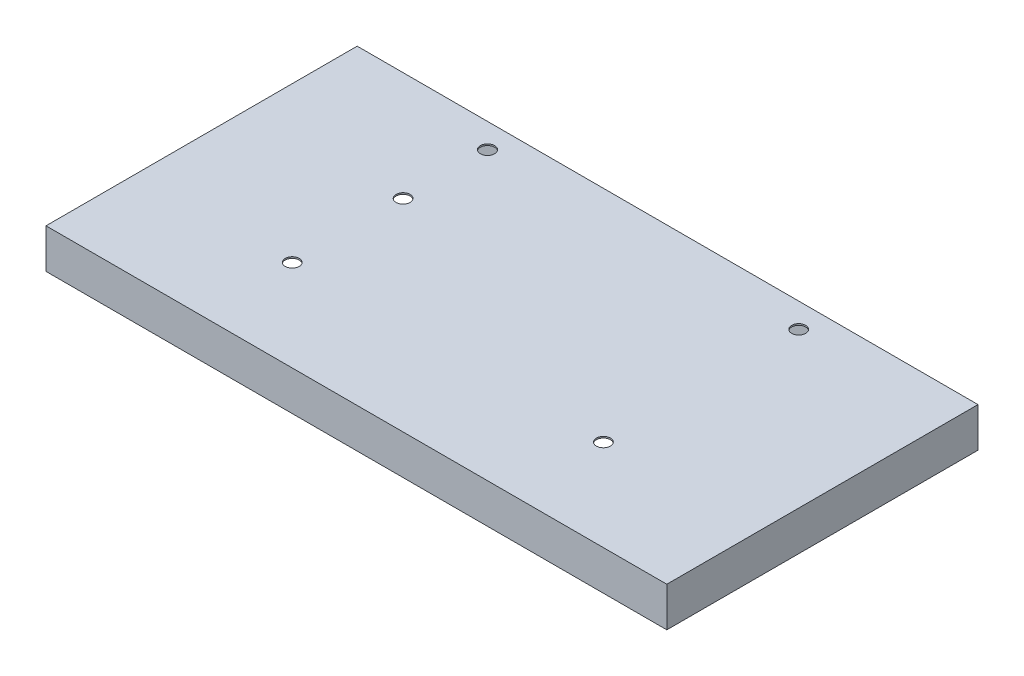
ISO-10303-21;
HEADER;
FILE_DESCRIPTION(('STEP AP214'),'2;1');
FILE_NAME('part.step','',(''),(''),'','','');
FILE_SCHEMA(('AUTOMOTIVE_DESIGN { 1 0 10303 214 1 1 1 1 }'));
ENDSEC;
DATA;
#1=APPLICATION_CONTEXT('core data for automotive mechanical design processes');
#2=APPLICATION_PROTOCOL_DEFINITION('international standard','automotive_design',2000,#1);
#3=PRODUCT_CONTEXT('',#1,'mechanical');
#4=PRODUCT('Part','Part','',(#3));
#5=PRODUCT_RELATED_PRODUCT_CATEGORY('part','',(#4));
#6=PRODUCT_DEFINITION_FORMATION('','',#4);
#7=PRODUCT_DEFINITION_CONTEXT('part definition',#1,'design');
#8=PRODUCT_DEFINITION('design','',#6,#7);
#9=PRODUCT_DEFINITION_SHAPE('','',#8);
#10=(LENGTH_UNIT() NAMED_UNIT(*) SI_UNIT(.MILLI.,.METRE.));
#11=(NAMED_UNIT(*) PLANE_ANGLE_UNIT() SI_UNIT($,.RADIAN.));
#12=(NAMED_UNIT(*) SI_UNIT($,.STERADIAN.) SOLID_ANGLE_UNIT());
#13=UNCERTAINTY_MEASURE_WITH_UNIT(LENGTH_MEASURE(1.E-05),#10,'distance_accuracy_value','');
#14=(GEOMETRIC_REPRESENTATION_CONTEXT(3) GLOBAL_UNCERTAINTY_ASSIGNED_CONTEXT((#13)) GLOBAL_UNIT_ASSIGNED_CONTEXT((#10,
#11,#12)) REPRESENTATION_CONTEXT('',''));
#15=CARTESIAN_POINT('',(0.,0.,0.));
#16=DIRECTION('',(0.,0.,1.));
#17=DIRECTION('',(1.,0.,0.));
#18=AXIS2_PLACEMENT_3D('',#15,#16,#17);
#19=CARTESIAN_POINT('',(399.,50.8,-200.));
#20=DIRECTION('',(-1.,0.,0.));
#21=DIRECTION('',(0.,0.,1.));
#22=AXIS2_PLACEMENT_3D('',#19,#20,#21);
#23=PLANE('',#22);
#24=DIRECTION('',(0.,0.,-1.));
#25=VECTOR('',#24,1.);
#26=CARTESIAN_POINT('',(399.,0.,-200.));
#27=LINE('',#26,#25);
#28=CARTESIAN_POINT('',(399.,0.,200.));
#29=VERTEX_POINT('',#28);
#30=CARTESIAN_POINT('',(399.,0.,-200.));
#31=VERTEX_POINT('',#30);
#32=EDGE_CURVE('E132',#29,#31,#27,.T.);
#33=ORIENTED_EDGE('',*,*,#32,.T.);
#34=DIRECTION('',(0.,-1.,0.));
#35=VECTOR('',#34,1.);
#36=CARTESIAN_POINT('',(399.,50.8,-200.));
#37=LINE('',#36,#35);
#38=CARTESIAN_POINT('',(399.,50.8,-200.));
#39=VERTEX_POINT('',#38);
#40=EDGE_CURVE('E11',#39,#31,#37,.T.);
#41=ORIENTED_EDGE('',*,*,#40,.F.);
#42=DIRECTION('',(0.,0.,-1.));
#43=VECTOR('',#42,1.);
#44=CARTESIAN_POINT('',(399.,50.8,-200.));
#45=LINE('',#44,#43);
#46=CARTESIAN_POINT('',(399.,50.8,200.));
#47=VERTEX_POINT('',#46);
#48=EDGE_CURVE('E156',#47,#39,#45,.T.);
#49=ORIENTED_EDGE('',*,*,#48,.F.);
#50=DIRECTION('',(0.,-1.,0.));
#51=VECTOR('',#50,1.);
#52=CARTESIAN_POINT('',(399.,50.8,200.));
#53=LINE('',#52,#51);
#54=EDGE_CURVE('E161',#47,#29,#53,.T.);
#55=ORIENTED_EDGE('',*,*,#54,.T.);
#56=EDGE_LOOP('',(#33,#41,#49,#55));
#57=FACE_BOUND('',#56,.T.);
#58=ADVANCED_FACE('F34',(#57),#23,.F.);
#59=CARTESIAN_POINT('',(-399.,50.8,-200.));
#60=DIRECTION('',(0.,0.,1.));
#61=DIRECTION('',(1.,0.,0.));
#62=AXIS2_PLACEMENT_3D('',#59,#60,#61);
#63=PLANE('',#62);
#64=DIRECTION('',(-1.,0.,0.));
#65=VECTOR('',#64,1.);
#66=CARTESIAN_POINT('',(-399.,0.,-200.));
#67=LINE('',#66,#65);
#68=CARTESIAN_POINT('',(-399.,0.,-200.));
#69=VERTEX_POINT('',#68);
#70=EDGE_CURVE('E136',#31,#69,#67,.T.);
#71=ORIENTED_EDGE('',*,*,#70,.T.);
#72=DIRECTION('',(0.,-1.,0.));
#73=VECTOR('',#72,1.);
#74=CARTESIAN_POINT('',(-399.,50.8,-200.));
#75=LINE('',#74,#73);
#76=CARTESIAN_POINT('',(-399.,50.8,-200.));
#77=VERTEX_POINT('',#76);
#78=EDGE_CURVE('E42',#77,#69,#75,.T.);
#79=ORIENTED_EDGE('',*,*,#78,.F.);
#80=DIRECTION('',(-1.,0.,0.));
#81=VECTOR('',#80,1.);
#82=CARTESIAN_POINT('',(-399.,50.8,-200.));
#83=LINE('',#82,#81);
#84=EDGE_CURVE('E87',#39,#77,#83,.T.);
#85=ORIENTED_EDGE('',*,*,#84,.F.);
#86=ORIENTED_EDGE('',*,*,#40,.T.);
#87=EDGE_LOOP('',(#71,#79,#85,#86));
#88=FACE_BOUND('',#87,.T.);
#89=ADVANCED_FACE('F203',(#88),#63,.F.);
#90=CARTESIAN_POINT('',(-399.,50.8,-200.));
#91=DIRECTION('',(1.,0.,0.));
#92=DIRECTION('',(0.,0.,-1.));
#93=AXIS2_PLACEMENT_3D('',#90,#91,#92);
#94=PLANE('',#93);
#95=DIRECTION('',(0.,0.,1.));
#96=VECTOR('',#95,1.);
#97=CARTESIAN_POINT('',(-399.,0.,-200.));
#98=LINE('',#97,#96);
#99=CARTESIAN_POINT('',(-399.,0.,200.));
#100=VERTEX_POINT('',#99);
#101=EDGE_CURVE('E164',#69,#100,#98,.T.);
#102=ORIENTED_EDGE('',*,*,#101,.T.);
#103=DIRECTION('',(0.,-1.,0.));
#104=VECTOR('',#103,1.);
#105=CARTESIAN_POINT('',(-399.,50.8,200.));
#106=LINE('',#105,#104);
#107=CARTESIAN_POINT('',(-399.,50.8,200.));
#108=VERTEX_POINT('',#107);
#109=EDGE_CURVE('E168',#108,#100,#106,.T.);
#110=ORIENTED_EDGE('',*,*,#109,.F.);
#111=DIRECTION('',(0.,0.,1.));
#112=VECTOR('',#111,1.);
#113=CARTESIAN_POINT('',(-399.,50.8,-200.));
#114=LINE('',#113,#112);
#115=EDGE_CURVE('E159',#77,#108,#114,.T.);
#116=ORIENTED_EDGE('',*,*,#115,.F.);
#117=ORIENTED_EDGE('',*,*,#78,.T.);
#118=EDGE_LOOP('',(#102,#110,#116,#117));
#119=FACE_BOUND('',#118,.T.);
#120=ADVANCED_FACE('F208',(#119),#94,.F.);
#121=CARTESIAN_POINT('',(-399.,50.8,200.));
#122=DIRECTION('',(0.,0.,-1.));
#123=DIRECTION('',(-1.,0.,0.));
#124=AXIS2_PLACEMENT_3D('',#121,#122,#123);
#125=PLANE('',#124);
#126=DIRECTION('',(1.,0.,0.));
#127=VECTOR('',#126,1.);
#128=CARTESIAN_POINT('',(-399.,0.,200.));
#129=LINE('',#128,#127);
#130=EDGE_CURVE('E80',#100,#29,#129,.T.);
#131=ORIENTED_EDGE('',*,*,#130,.T.);
#132=ORIENTED_EDGE('',*,*,#54,.F.);
#133=DIRECTION('',(1.,0.,0.));
#134=VECTOR('',#133,1.);
#135=CARTESIAN_POINT('',(-399.,50.8,200.));
#136=LINE('',#135,#134);
#137=EDGE_CURVE('E59',#108,#47,#136,.T.);
#138=ORIENTED_EDGE('',*,*,#137,.F.);
#139=ORIENTED_EDGE('',*,*,#109,.T.);
#140=EDGE_LOOP('',(#131,#132,#138,#139));
#141=FACE_BOUND('',#140,.T.);
#142=ADVANCED_FACE('F196',(#141),#125,.F.);
#143=CARTESIAN_POINT('',(0.,50.8,0.));
#144=DIRECTION('',(0.,1.,0.));
#145=DIRECTION('',(0.,0.,1.));
#146=AXIS2_PLACEMENT_3D('',#143,#144,#145);
#147=PLANE('',#146);
#148=CARTESIAN_POINT('',(-199.99999999997,50.8,-168.499999999993));
#149=DIRECTION('',(0.,1.,0.));
#150=DIRECTION('',(0.,0.,1.));
#151=AXIS2_PLACEMENT_3D('',#148,#149,#150);
#152=CIRCLE('',#151,9.17877309023134);
#153=CARTESIAN_POINT('',(-199.99999999997,50.8,-159.321226909761));
#154=VERTEX_POINT('',#153);
#155=EDGE_CURVE('E337',#154,#154,#152,.T.);
#156=ORIENTED_EDGE('',*,*,#155,.F.);
#157=EDGE_LOOP('',(#156));
#158=FACE_BOUND('',#157,.T.);
#159=CARTESIAN_POINT('',(-199.999999999969,50.8,-59.9999999999926));
#160=DIRECTION('',(0.,1.,0.));
#161=DIRECTION('',(0.,0.,1.));
#162=AXIS2_PLACEMENT_3D('',#159,#160,#161);
#163=CIRCLE('',#162,9.00000000000001);
#164=CARTESIAN_POINT('',(-199.999999999969,50.8,-50.9999999999926));
#165=VERTEX_POINT('',#164);
#166=EDGE_CURVE('E338',#165,#165,#163,.T.);
#167=ORIENTED_EDGE('',*,*,#166,.F.);
#168=EDGE_LOOP('',(#167));
#169=FACE_BOUND('',#168,.T.);
#170=CARTESIAN_POINT('',(-199.999999999967,50.8,82.5000000000074));
#171=DIRECTION('',(0.,1.,0.));
#172=DIRECTION('',(0.,0.,1.));
#173=AXIS2_PLACEMENT_3D('',#170,#171,#172);
#174=CIRCLE('',#173,9.00000000000001);
#175=CARTESIAN_POINT('',(-199.999999999967,50.8,91.5000000000074));
#176=VERTEX_POINT('',#175);
#177=EDGE_CURVE('E341',#176,#176,#174,.T.);
#178=ORIENTED_EDGE('',*,*,#177,.F.);
#179=EDGE_LOOP('',(#178));
#180=FACE_BOUND('',#179,.T.);
#181=CARTESIAN_POINT('',(200.00000000003,50.8,-168.499999999997));
#182=DIRECTION('',(0.,1.,0.));
#183=DIRECTION('',(0.,0.,1.));
#184=AXIS2_PLACEMENT_3D('',#181,#182,#183);
#185=CIRCLE('',#184,9.00000000000001);
#186=CARTESIAN_POINT('',(200.00000000003,50.8,-159.499999999997));
#187=VERTEX_POINT('',#186);
#188=EDGE_CURVE('E178',#187,#187,#185,.T.);
#189=ORIENTED_EDGE('',*,*,#188,.F.);
#190=EDGE_LOOP('',(#189));
#191=FACE_BOUND('',#190,.T.);
#192=CARTESIAN_POINT('',(200.000000000033,50.8,82.5000000000032));
#193=DIRECTION('',(0.,1.,0.));
#194=DIRECTION('',(0.,0.,1.));
#195=AXIS2_PLACEMENT_3D('',#192,#193,#194);
#196=CIRCLE('',#195,9.00000000000001);
#197=CARTESIAN_POINT('',(200.000000000033,50.8,91.5000000000032));
#198=VERTEX_POINT('',#197);
#199=EDGE_CURVE('E141',#198,#198,#196,.T.);
#200=ORIENTED_EDGE('',*,*,#199,.F.);
#201=EDGE_LOOP('',(#200));
#202=FACE_BOUND('',#201,.T.);
#203=ORIENTED_EDGE('',*,*,#48,.T.);
#204=ORIENTED_EDGE('',*,*,#84,.T.);
#205=ORIENTED_EDGE('',*,*,#115,.T.);
#206=ORIENTED_EDGE('',*,*,#137,.T.);
#207=EDGE_LOOP('',(#203,#204,#205,#206));
#208=FACE_BOUND('',#207,.T.);
#209=ADVANCED_FACE('F193',(#158,#169,#180,#191,#202,#208),#147,.T.);
#210=CARTESIAN_POINT('',(0.,0.,0.));
#211=DIRECTION('',(0.,1.,0.));
#212=DIRECTION('',(0.,0.,1.));
#213=AXIS2_PLACEMENT_3D('',#210,#211,#212);
#214=PLANE('',#213);
#215=DIRECTION('',(1.,0.,0.));
#216=VECTOR('',#215,1.);
#217=CARTESIAN_POINT('',(-399.,0.,198.1));
#218=LINE('',#217,#216);
#219=CARTESIAN_POINT('',(-397.1,0.,198.1));
#220=VERTEX_POINT('',#219);
#221=CARTESIAN_POINT('',(397.1,0.,198.1));
#222=VERTEX_POINT('',#221);
#223=EDGE_CURVE('E127',#220,#222,#218,.T.);
#224=ORIENTED_EDGE('',*,*,#223,.T.);
#225=DIRECTION('',(0.,0.,-1.));
#226=VECTOR('',#225,1.);
#227=CARTESIAN_POINT('',(397.1,0.,-200.));
#228=LINE('',#227,#226);
#229=CARTESIAN_POINT('',(397.1,0.,-198.1));
#230=VERTEX_POINT('',#229);
#231=EDGE_CURVE('E149',#222,#230,#228,.T.);
#232=ORIENTED_EDGE('',*,*,#231,.T.);
#233=DIRECTION('',(-1.,0.,0.));
#234=VECTOR('',#233,1.);
#235=CARTESIAN_POINT('',(-399.,0.,-198.1));
#236=LINE('',#235,#234);
#237=CARTESIAN_POINT('',(-397.1,0.,-198.1));
#238=VERTEX_POINT('',#237);
#239=EDGE_CURVE('E131',#230,#238,#236,.T.);
#240=ORIENTED_EDGE('',*,*,#239,.T.);
#241=DIRECTION('',(0.,0.,1.));
#242=VECTOR('',#241,1.);
#243=CARTESIAN_POINT('',(-397.1,0.,-200.));
#244=LINE('',#243,#242);
#245=EDGE_CURVE('E50',#238,#220,#244,.T.);
#246=ORIENTED_EDGE('',*,*,#245,.T.);
#247=EDGE_LOOP('',(#224,#232,#240,#246));
#248=FACE_BOUND('',#247,.T.);
#249=ORIENTED_EDGE('',*,*,#32,.F.);
#250=ORIENTED_EDGE('',*,*,#130,.F.);
#251=ORIENTED_EDGE('',*,*,#101,.F.);
#252=ORIENTED_EDGE('',*,*,#70,.F.);
#253=EDGE_LOOP('',(#249,#250,#251,#252));
#254=FACE_BOUND('',#253,.T.);
#255=ADVANCED_FACE('F195',(#248,#254),#214,.F.);
#256=CARTESIAN_POINT('',(397.1,50.8,-200.));
#257=DIRECTION('',(-1.,0.,0.));
#258=DIRECTION('',(0.,0.,1.));
#259=AXIS2_PLACEMENT_3D('',#256,#257,#258);
#260=PLANE('',#259);
#261=ORIENTED_EDGE('',*,*,#231,.F.);
#262=DIRECTION('',(0.,-1.,0.));
#263=VECTOR('',#262,1.);
#264=CARTESIAN_POINT('',(397.1,50.8,198.1));
#265=LINE('',#264,#263);
#266=CARTESIAN_POINT('',(397.1,48.9,198.1));
#267=VERTEX_POINT('',#266);
#268=EDGE_CURVE('E126',#267,#222,#265,.T.);
#269=ORIENTED_EDGE('',*,*,#268,.F.);
#270=DIRECTION('',(0.,0.,-1.));
#271=VECTOR('',#270,1.);
#272=CARTESIAN_POINT('',(397.1,48.9,-200.));
#273=LINE('',#272,#271);
#274=CARTESIAN_POINT('',(397.1,48.9,-198.1));
#275=VERTEX_POINT('',#274);
#276=EDGE_CURVE('E114',#267,#275,#273,.T.);
#277=ORIENTED_EDGE('',*,*,#276,.T.);
#278=DIRECTION('',(0.,-1.,0.));
#279=VECTOR('',#278,1.);
#280=CARTESIAN_POINT('',(397.1,50.8,-198.1));
#281=LINE('',#280,#279);
#282=EDGE_CURVE('E124',#275,#230,#281,.T.);
#283=ORIENTED_EDGE('',*,*,#282,.T.);
#284=EDGE_LOOP('',(#261,#269,#277,#283));
#285=FACE_BOUND('',#284,.T.);
#286=ADVANCED_FACE('F123',(#285),#260,.T.);
#287=CARTESIAN_POINT('',(-399.,50.8,-198.1));
#288=DIRECTION('',(0.,0.,1.));
#289=DIRECTION('',(1.,0.,0.));
#290=AXIS2_PLACEMENT_3D('',#287,#288,#289);
#291=PLANE('',#290);
#292=ORIENTED_EDGE('',*,*,#239,.F.);
#293=ORIENTED_EDGE('',*,*,#282,.F.);
#294=DIRECTION('',(-1.,0.,0.));
#295=VECTOR('',#294,1.);
#296=CARTESIAN_POINT('',(-399.,48.9,-198.1));
#297=LINE('',#296,#295);
#298=CARTESIAN_POINT('',(-397.1,48.9,-198.1));
#299=VERTEX_POINT('',#298);
#300=EDGE_CURVE('E110',#275,#299,#297,.T.);
#301=ORIENTED_EDGE('',*,*,#300,.T.);
#302=DIRECTION('',(0.,-1.,0.));
#303=VECTOR('',#302,1.);
#304=CARTESIAN_POINT('',(-397.1,50.8,-198.1));
#305=LINE('',#304,#303);
#306=EDGE_CURVE('E133',#299,#238,#305,.T.);
#307=ORIENTED_EDGE('',*,*,#306,.T.);
#308=EDGE_LOOP('',(#292,#293,#301,#307));
#309=FACE_BOUND('',#308,.T.);
#310=ADVANCED_FACE('F129',(#309),#291,.T.);
#311=CARTESIAN_POINT('',(-397.1,50.8,-200.));
#312=DIRECTION('',(1.,0.,0.));
#313=DIRECTION('',(0.,0.,-1.));
#314=AXIS2_PLACEMENT_3D('',#311,#312,#313);
#315=PLANE('',#314);
#316=ORIENTED_EDGE('',*,*,#245,.F.);
#317=ORIENTED_EDGE('',*,*,#306,.F.);
#318=DIRECTION('',(0.,0.,1.));
#319=VECTOR('',#318,1.);
#320=CARTESIAN_POINT('',(-397.1,48.9,-200.));
#321=LINE('',#320,#319);
#322=CARTESIAN_POINT('',(-397.1,48.9,198.1));
#323=VERTEX_POINT('',#322);
#324=EDGE_CURVE('E115',#299,#323,#321,.T.);
#325=ORIENTED_EDGE('',*,*,#324,.T.);
#326=DIRECTION('',(0.,-1.,0.));
#327=VECTOR('',#326,1.);
#328=CARTESIAN_POINT('',(-397.1,50.8,198.1));
#329=LINE('',#328,#327);
#330=EDGE_CURVE('E138',#323,#220,#329,.T.);
#331=ORIENTED_EDGE('',*,*,#330,.T.);
#332=EDGE_LOOP('',(#316,#317,#325,#331));
#333=FACE_BOUND('',#332,.T.);
#334=ADVANCED_FACE('F305',(#333),#315,.T.);
#335=CARTESIAN_POINT('',(-399.,50.8,198.1));
#336=DIRECTION('',(0.,0.,-1.));
#337=DIRECTION('',(-1.,0.,0.));
#338=AXIS2_PLACEMENT_3D('',#335,#336,#337);
#339=PLANE('',#338);
#340=ORIENTED_EDGE('',*,*,#223,.F.);
#341=ORIENTED_EDGE('',*,*,#330,.F.);
#342=DIRECTION('',(1.,0.,0.));
#343=VECTOR('',#342,1.);
#344=CARTESIAN_POINT('',(-399.,48.9,198.1));
#345=LINE('',#344,#343);
#346=EDGE_CURVE('E144',#323,#267,#345,.T.);
#347=ORIENTED_EDGE('',*,*,#346,.T.);
#348=ORIENTED_EDGE('',*,*,#268,.T.);
#349=EDGE_LOOP('',(#340,#341,#347,#348));
#350=FACE_BOUND('',#349,.T.);
#351=ADVANCED_FACE('F242',(#350),#339,.T.);
#352=CARTESIAN_POINT('',(0.,48.9,0.));
#353=DIRECTION('',(0.,1.,0.));
#354=DIRECTION('',(0.,0.,1.));
#355=AXIS2_PLACEMENT_3D('',#352,#353,#354);
#356=PLANE('',#355);
#357=CARTESIAN_POINT('',(-199.99999999997,48.9,-168.499999999993));
#358=DIRECTION('',(0.,1.,0.));
#359=DIRECTION('',(0.,0.,1.));
#360=AXIS2_PLACEMENT_3D('',#357,#358,#359);
#361=CIRCLE('',#360,9.17877309023134);
#362=CARTESIAN_POINT('',(-199.99999999997,48.9,-159.321226909761));
#363=VERTEX_POINT('',#362);
#364=EDGE_CURVE('E37',#363,#363,#361,.T.);
#365=ORIENTED_EDGE('',*,*,#364,.T.);
#366=EDGE_LOOP('',(#365));
#367=FACE_BOUND('',#366,.T.);
#368=CARTESIAN_POINT('',(-199.999999999969,48.9,-59.9999999999926));
#369=DIRECTION('',(0.,1.,0.));
#370=DIRECTION('',(0.,0.,1.));
#371=AXIS2_PLACEMENT_3D('',#368,#369,#370);
#372=CIRCLE('',#371,9.00000000000001);
#373=CARTESIAN_POINT('',(-199.999999999969,48.9,-50.9999999999926));
#374=VERTEX_POINT('',#373);
#375=EDGE_CURVE('E180',#374,#374,#372,.T.);
#376=ORIENTED_EDGE('',*,*,#375,.T.);
#377=EDGE_LOOP('',(#376));
#378=FACE_BOUND('',#377,.T.);
#379=CARTESIAN_POINT('',(-199.999999999967,48.9,82.5000000000074));
#380=DIRECTION('',(0.,1.,0.));
#381=DIRECTION('',(0.,0.,1.));
#382=AXIS2_PLACEMENT_3D('',#379,#380,#381);
#383=CIRCLE('',#382,9.00000000000001);
#384=CARTESIAN_POINT('',(-199.999999999967,48.9,91.5000000000074));
#385=VERTEX_POINT('',#384);
#386=EDGE_CURVE('E177',#385,#385,#383,.T.);
#387=ORIENTED_EDGE('',*,*,#386,.T.);
#388=EDGE_LOOP('',(#387));
#389=FACE_BOUND('',#388,.T.);
#390=CARTESIAN_POINT('',(200.00000000003,48.9,-168.499999999997));
#391=DIRECTION('',(0.,1.,0.));
#392=DIRECTION('',(0.,0.,1.));
#393=AXIS2_PLACEMENT_3D('',#390,#391,#392);
#394=CIRCLE('',#393,9.00000000000001);
#395=CARTESIAN_POINT('',(200.00000000003,48.9,-159.499999999997));
#396=VERTEX_POINT('',#395);
#397=EDGE_CURVE('E174',#396,#396,#394,.T.);
#398=ORIENTED_EDGE('',*,*,#397,.T.);
#399=EDGE_LOOP('',(#398));
#400=FACE_BOUND('',#399,.T.);
#401=CARTESIAN_POINT('',(200.000000000033,48.9,82.5000000000032));
#402=DIRECTION('',(0.,1.,0.));
#403=DIRECTION('',(0.,0.,1.));
#404=AXIS2_PLACEMENT_3D('',#401,#402,#403);
#405=CIRCLE('',#404,9.00000000000001);
#406=CARTESIAN_POINT('',(200.000000000033,48.9,91.5000000000032));
#407=VERTEX_POINT('',#406);
#408=EDGE_CURVE('E151',#407,#407,#405,.T.);
#409=ORIENTED_EDGE('',*,*,#408,.T.);
#410=EDGE_LOOP('',(#409));
#411=FACE_BOUND('',#410,.T.);
#412=ORIENTED_EDGE('',*,*,#276,.F.);
#413=ORIENTED_EDGE('',*,*,#346,.F.);
#414=ORIENTED_EDGE('',*,*,#324,.F.);
#415=ORIENTED_EDGE('',*,*,#300,.F.);
#416=EDGE_LOOP('',(#412,#413,#414,#415));
#417=FACE_BOUND('',#416,.T.);
#418=ADVANCED_FACE('F112',(#367,#378,#389,#400,#411,#417),#356,.F.);
#419=CARTESIAN_POINT('',(200.000000000033,40.8,82.5000000000032));
#420=DIRECTION('',(0.,1.,0.));
#421=DIRECTION('',(0.,0.,1.));
#422=AXIS2_PLACEMENT_3D('',#419,#420,#421);
#423=CYLINDRICAL_SURFACE('',#422,9.00000000000001);
#424=ORIENTED_EDGE('',*,*,#199,.T.);
#425=EDGE_LOOP('',(#424));
#426=FACE_BOUND('',#425,.T.);
#427=ORIENTED_EDGE('',*,*,#408,.F.);
#428=EDGE_LOOP('',(#427));
#429=FACE_BOUND('',#428,.T.);
#430=ADVANCED_FACE('F190',(#426,#429),#423,.F.);
#431=CARTESIAN_POINT('',(200.00000000003,40.8,-168.499999999997));
#432=DIRECTION('',(0.,1.,0.));
#433=DIRECTION('',(0.,0.,1.));
#434=AXIS2_PLACEMENT_3D('',#431,#432,#433);
#435=CYLINDRICAL_SURFACE('',#434,9.00000000000001);
#436=ORIENTED_EDGE('',*,*,#188,.T.);
#437=EDGE_LOOP('',(#436));
#438=FACE_BOUND('',#437,.T.);
#439=ORIENTED_EDGE('',*,*,#397,.F.);
#440=EDGE_LOOP('',(#439));
#441=FACE_BOUND('',#440,.T.);
#442=ADVANCED_FACE('F257',(#438,#441),#435,.F.);
#443=CARTESIAN_POINT('',(-199.999999999967,40.8,82.5000000000074));
#444=DIRECTION('',(0.,1.,0.));
#445=DIRECTION('',(0.,0.,1.));
#446=AXIS2_PLACEMENT_3D('',#443,#444,#445);
#447=CYLINDRICAL_SURFACE('',#446,9.00000000000001);
#448=ORIENTED_EDGE('',*,*,#177,.T.);
#449=EDGE_LOOP('',(#448));
#450=FACE_BOUND('',#449,.T.);
#451=ORIENTED_EDGE('',*,*,#386,.F.);
#452=EDGE_LOOP('',(#451));
#453=FACE_BOUND('',#452,.T.);
#454=ADVANCED_FACE('F266',(#450,#453),#447,.F.);
#455=CARTESIAN_POINT('',(-199.999999999969,40.8,-59.9999999999926));
#456=DIRECTION('',(0.,1.,0.));
#457=DIRECTION('',(0.,0.,1.));
#458=AXIS2_PLACEMENT_3D('',#455,#456,#457);
#459=CYLINDRICAL_SURFACE('',#458,9.00000000000001);
#460=ORIENTED_EDGE('',*,*,#166,.T.);
#461=EDGE_LOOP('',(#460));
#462=FACE_BOUND('',#461,.T.);
#463=ORIENTED_EDGE('',*,*,#375,.F.);
#464=EDGE_LOOP('',(#463));
#465=FACE_BOUND('',#464,.T.);
#466=ADVANCED_FACE('F276',(#462,#465),#459,.F.);
#467=CARTESIAN_POINT('',(-199.99999999997,40.8,-168.499999999993));
#468=DIRECTION('',(0.,1.,0.));
#469=DIRECTION('',(0.,0.,1.));
#470=AXIS2_PLACEMENT_3D('',#467,#468,#469);
#471=CYLINDRICAL_SURFACE('',#470,9.17877309023134);
#472=ORIENTED_EDGE('',*,*,#155,.T.);
#473=EDGE_LOOP('',(#472));
#474=FACE_BOUND('',#473,.T.);
#475=ORIENTED_EDGE('',*,*,#364,.F.);
#476=EDGE_LOOP('',(#475));
#477=FACE_BOUND('',#476,.T.);
#478=ADVANCED_FACE('F286',(#474,#477),#471,.F.);
#479=CLOSED_SHELL('',(#58,#89,#120,#142,#209,#255,#286,#310,#334,#351,#418,#430,#442,#454,#466,#478));
#480=MANIFOLD_SOLID_BREP('B2',#479);
#481=ADVANCED_BREP_SHAPE_REPRESENTATION('',(#18,#480),#14);
#482=SHAPE_DEFINITION_REPRESENTATION(#9,#481);
ENDSEC;
END-ISO-10303-21;
